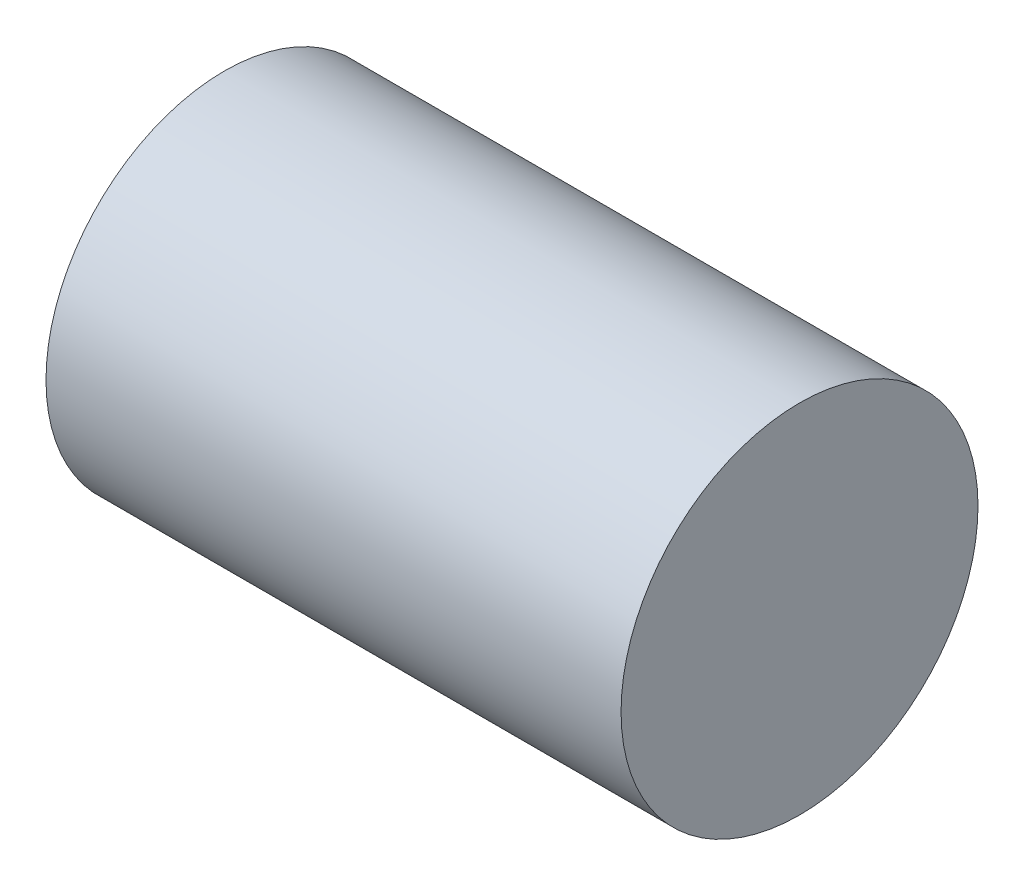
ISO-10303-21;
HEADER;
FILE_DESCRIPTION(('STEP AP214'),'2;1');
FILE_NAME('part.step','',(''),(''),'','','');
FILE_SCHEMA(('AUTOMOTIVE_DESIGN { 1 0 10303 214 1 1 1 1 }'));
ENDSEC;
DATA;
#1=APPLICATION_CONTEXT('core data for automotive mechanical design processes');
#2=APPLICATION_PROTOCOL_DEFINITION('international standard','automotive_design',2000,#1);
#3=PRODUCT_CONTEXT('',#1,'mechanical');
#4=PRODUCT('Part','Part','',(#3));
#5=PRODUCT_RELATED_PRODUCT_CATEGORY('part','',(#4));
#6=PRODUCT_DEFINITION_FORMATION('','',#4);
#7=PRODUCT_DEFINITION_CONTEXT('part definition',#1,'design');
#8=PRODUCT_DEFINITION('design','',#6,#7);
#9=PRODUCT_DEFINITION_SHAPE('','',#8);
#10=(LENGTH_UNIT() NAMED_UNIT(*) SI_UNIT(.MILLI.,.METRE.));
#11=(NAMED_UNIT(*) PLANE_ANGLE_UNIT() SI_UNIT($,.RADIAN.));
#12=(NAMED_UNIT(*) SI_UNIT($,.STERADIAN.) SOLID_ANGLE_UNIT());
#13=UNCERTAINTY_MEASURE_WITH_UNIT(LENGTH_MEASURE(1.E-05),#10,'distance_accuracy_value','');
#14=(GEOMETRIC_REPRESENTATION_CONTEXT(3) GLOBAL_UNCERTAINTY_ASSIGNED_CONTEXT((#13)) GLOBAL_UNIT_ASSIGNED_CONTEXT((#10,
#11,#12)) REPRESENTATION_CONTEXT('',''));
#15=CARTESIAN_POINT('',(0.,0.,0.));
#16=DIRECTION('',(0.,0.,1.));
#17=DIRECTION('',(1.,0.,0.));
#18=AXIS2_PLACEMENT_3D('',#15,#16,#17);
#19=CARTESIAN_POINT('',(-57.,0.,57.));
#20=DIRECTION('',(-1.,0.,0.));
#21=DIRECTION('',(0.,0.,1.));
#22=AXIS2_PLACEMENT_3D('',#19,#20,#21);
#23=PLANE('',#22);
#24=CARTESIAN_POINT('',(-57.,0.,57.));
#25=DIRECTION('',(-1.,0.,0.));
#26=DIRECTION('',(0.,0.,-1.));
#27=AXIS2_PLACEMENT_3D('',#24,#25,#26);
#28=CIRCLE('',#27,4.5);
#29=CARTESIAN_POINT('',(-57.,0.,52.5));
#30=VERTEX_POINT('',#29);
#31=EDGE_CURVE('E9',#30,#30,#28,.T.);
#32=ORIENTED_EDGE('',*,*,#31,.F.);
#33=EDGE_LOOP('',(#32));
#34=FACE_BOUND('',#33,.T.);
#35=ADVANCED_FACE('F14',(#34),#23,.F.);
#36=CARTESIAN_POINT('',(-71.5,0.,57.));
#37=DIRECTION('',(-1.,0.,0.));
#38=DIRECTION('',(0.,0.,1.));
#39=AXIS2_PLACEMENT_3D('',#36,#37,#38);
#40=PLANE('',#39);
#41=CARTESIAN_POINT('',(-71.5,0.,57.));
#42=DIRECTION('',(-1.,0.,0.));
#43=DIRECTION('',(0.,0.,-1.));
#44=AXIS2_PLACEMENT_3D('',#41,#42,#43);
#45=CIRCLE('',#44,4.5);
#46=CARTESIAN_POINT('',(-71.5,0.,52.5));
#47=VERTEX_POINT('',#46);
#48=EDGE_CURVE('E39',#47,#47,#45,.T.);
#49=ORIENTED_EDGE('',*,*,#48,.T.);
#50=EDGE_LOOP('',(#49));
#51=FACE_BOUND('',#50,.T.);
#52=ADVANCED_FACE('F16',(#51),#40,.T.);
#53=CARTESIAN_POINT('',(-57.,0.,57.));
#54=DIRECTION('',(-1.,0.,0.));
#55=DIRECTION('',(0.,0.,-1.));
#56=AXIS2_PLACEMENT_3D('',#53,#54,#55);
#57=CYLINDRICAL_SURFACE('',#56,4.5);
#58=ORIENTED_EDGE('',*,*,#48,.F.);
#59=DIRECTION('',(-1.,0.,0.));
#60=VECTOR('',#59,1.);
#61=CARTESIAN_POINT('',(-57.,0.,52.5));
#62=LINE('',#61,#60);
#63=EDGE_CURVE('E23',#30,#47,#62,.T.);
#64=ORIENTED_EDGE('',*,*,#63,.F.);
#65=ORIENTED_EDGE('',*,*,#31,.T.);
#66=ORIENTED_EDGE('',*,*,#63,.T.);
#67=EDGE_LOOP('',(#58,#64,#65,#66));
#68=FACE_BOUND('',#67,.T.);
#69=ADVANCED_FACE('F38',(#68),#57,.T.);
#70=CLOSED_SHELL('',(#35,#52,#69));
#71=MANIFOLD_SOLID_BREP('B1',#70);
#72=ADVANCED_BREP_SHAPE_REPRESENTATION('',(#18,#71),#14);
#73=SHAPE_DEFINITION_REPRESENTATION(#9,#72);
ENDSEC;
END-ISO-10303-21;
